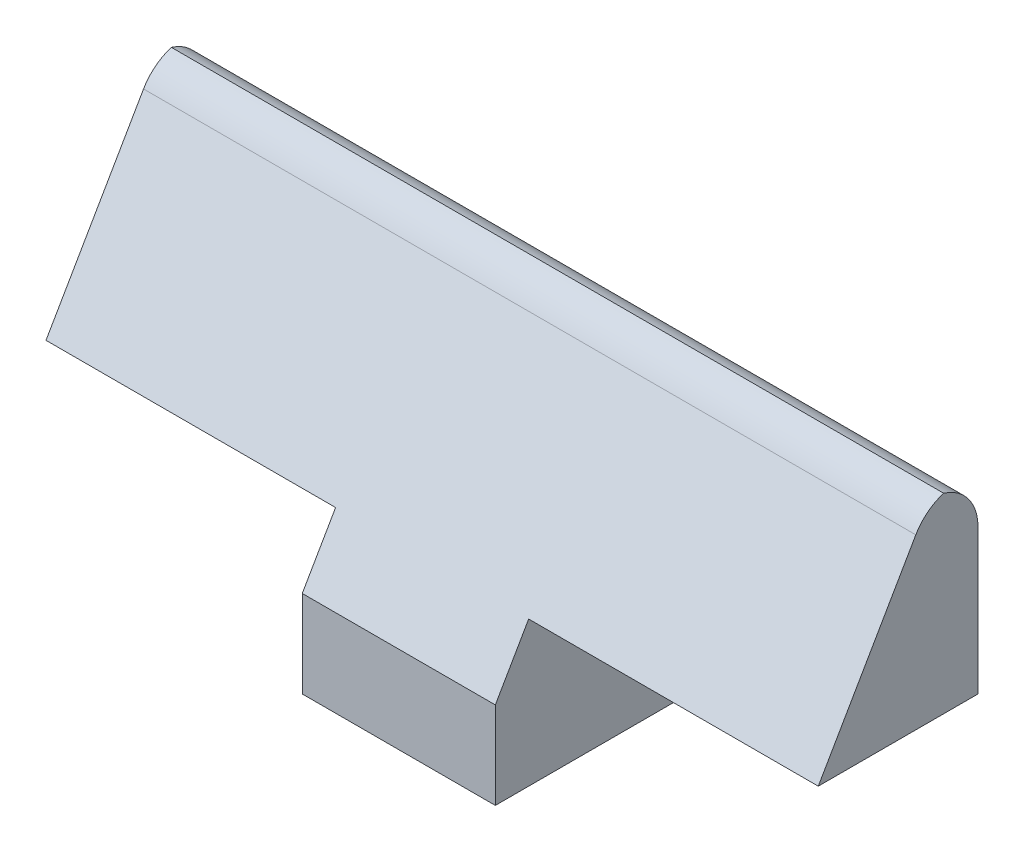
ISO-10303-21;
HEADER;
FILE_DESCRIPTION(('STEP AP214'),'2;1');
FILE_NAME('part.step','',(''),(''),'','','');
FILE_SCHEMA(('AUTOMOTIVE_DESIGN { 1 0 10303 214 1 1 1 1 }'));
ENDSEC;
DATA;
#1=APPLICATION_CONTEXT('core data for automotive mechanical design processes');
#2=APPLICATION_PROTOCOL_DEFINITION('international standard','automotive_design',2000,#1);
#3=PRODUCT_CONTEXT('',#1,'mechanical');
#4=PRODUCT('Part','Part','',(#3));
#5=PRODUCT_RELATED_PRODUCT_CATEGORY('part','',(#4));
#6=PRODUCT_DEFINITION_FORMATION('','',#4);
#7=PRODUCT_DEFINITION_CONTEXT('part definition',#1,'design');
#8=PRODUCT_DEFINITION('design','',#6,#7);
#9=PRODUCT_DEFINITION_SHAPE('','',#8);
#10=(LENGTH_UNIT() NAMED_UNIT(*) SI_UNIT(.MILLI.,.METRE.));
#11=(NAMED_UNIT(*) PLANE_ANGLE_UNIT() SI_UNIT($,.RADIAN.));
#12=(NAMED_UNIT(*) SI_UNIT($,.STERADIAN.) SOLID_ANGLE_UNIT());
#13=UNCERTAINTY_MEASURE_WITH_UNIT(LENGTH_MEASURE(1.E-05),#10,'distance_accuracy_value','');
#14=(GEOMETRIC_REPRESENTATION_CONTEXT(3) GLOBAL_UNCERTAINTY_ASSIGNED_CONTEXT((#13)) GLOBAL_UNIT_ASSIGNED_CONTEXT((#10,
#11,#12)) REPRESENTATION_CONTEXT('',''));
#15=CARTESIAN_POINT('',(0.,0.,0.));
#16=DIRECTION('',(0.,0.,1.));
#17=DIRECTION('',(1.,0.,0.));
#18=AXIS2_PLACEMENT_3D('',#15,#16,#17);
#19=CARTESIAN_POINT('',(25.4,0.,25.4));
#20=DIRECTION('',(0.,1.,0.));
#21=DIRECTION('',(0.,0.,1.));
#22=AXIS2_PLACEMENT_3D('',#19,#20,#21);
#23=PLANE('',#22);
#24=CARTESIAN_POINT('',(12.7,0.,12.7));
#25=DIRECTION('',(0.,-1.,0.));
#26=DIRECTION('',(0.,0.,-1.));
#27=AXIS2_PLACEMENT_3D('',#24,#25,#26);
#28=CIRCLE('',#27,8.33374);
#29=CARTESIAN_POINT('',(12.7,0.,4.36626));
#30=VERTEX_POINT('',#29);
#31=EDGE_CURVE('E126',#30,#30,#28,.T.);
#32=ORIENTED_EDGE('',*,*,#31,.F.);
#33=EDGE_LOOP('',(#32));
#34=FACE_BOUND('',#33,.T.);
#35=DIRECTION('',(1.,0.,0.));
#36=VECTOR('',#35,1.);
#37=CARTESIAN_POINT('',(25.4,0.,0.));
#38=LINE('',#37,#36);
#39=CARTESIAN_POINT('',(0.,0.,0.));
#40=VERTEX_POINT('',#39);
#41=CARTESIAN_POINT('',(25.4,0.,0.));
#42=VERTEX_POINT('',#41);
#43=EDGE_CURVE('E141',#40,#42,#38,.T.);
#44=ORIENTED_EDGE('',*,*,#43,.T.);
#45=DIRECTION('',(0.,0.,-1.));
#46=VECTOR('',#45,1.);
#47=CARTESIAN_POINT('',(25.4,0.,25.4));
#48=LINE('',#47,#46);
#49=CARTESIAN_POINT('',(25.4,0.,25.4));
#50=VERTEX_POINT('',#49);
#51=EDGE_CURVE('E169',#50,#42,#48,.T.);
#52=ORIENTED_EDGE('',*,*,#51,.F.);
#53=DIRECTION('',(1.,0.,0.));
#54=VECTOR('',#53,1.);
#55=CARTESIAN_POINT('',(25.4,0.,25.4));
#56=LINE('',#55,#54);
#57=CARTESIAN_POINT('',(0.,0.,25.4));
#58=VERTEX_POINT('',#57);
#59=EDGE_CURVE('E131',#58,#50,#56,.T.);
#60=ORIENTED_EDGE('',*,*,#59,.F.);
#61=DIRECTION('',(0.,0.,-1.));
#62=VECTOR('',#61,1.);
#63=CARTESIAN_POINT('',(0.,0.,25.4));
#64=LINE('',#63,#62);
#65=EDGE_CURVE('E140',#58,#40,#64,.T.);
#66=ORIENTED_EDGE('',*,*,#65,.T.);
#67=EDGE_LOOP('',(#44,#52,#60,#66));
#68=FACE_BOUND('',#67,.T.);
#69=ADVANCED_FACE('F42',(#34,#68),#23,.F.);
#70=CARTESIAN_POINT('',(25.4,19.05,25.4));
#71=DIRECTION('',(-1.,0.,0.));
#72=DIRECTION('',(0.,0.,1.));
#73=AXIS2_PLACEMENT_3D('',#70,#71,#72);
#74=PLANE('',#73);
#75=DIRECTION('',(0.,0.,-1.));
#76=VECTOR('',#75,1.);
#77=CARTESIAN_POINT('',(25.4,19.05,25.4));
#78=LINE('',#77,#76);
#79=CARTESIAN_POINT('',(25.4,19.05,21.0146968374165));
#80=VERTEX_POINT('',#79);
#81=CARTESIAN_POINT('',(25.4,19.05,0.));
#82=VERTEX_POINT('',#81);
#83=EDGE_CURVE('E167',#80,#82,#78,.T.);
#84=ORIENTED_EDGE('',*,*,#83,.F.);
#85=DIRECTION('',(0.,0.866025403784438,-0.500000000000001));
#86=VECTOR('',#85,1.);
#87=CARTESIAN_POINT('',(25.4,11.4544321158129,25.4));
#88=LINE('',#87,#86);
#89=CARTESIAN_POINT('',(25.4,11.4544321158129,25.4));
#90=VERTEX_POINT('',#89);
#91=EDGE_CURVE('E186',#80,#90,#88,.F.);
#92=ORIENTED_EDGE('',*,*,#91,.T.);
#93=DIRECTION('',(0.,1.,0.));
#94=VECTOR('',#93,1.);
#95=CARTESIAN_POINT('',(25.4,19.05,25.4));
#96=LINE('',#95,#94);
#97=EDGE_CURVE('E134',#50,#90,#96,.T.);
#98=ORIENTED_EDGE('',*,*,#97,.F.);
#99=ORIENTED_EDGE('',*,*,#51,.T.);
#100=DIRECTION('',(0.,1.,0.));
#101=VECTOR('',#100,1.);
#102=CARTESIAN_POINT('',(25.4,19.05,0.));
#103=LINE('',#102,#101);
#104=EDGE_CURVE('E144',#42,#82,#103,.T.);
#105=ORIENTED_EDGE('',*,*,#104,.T.);
#106=EDGE_LOOP('',(#84,#92,#98,#99,#105));
#107=FACE_BOUND('',#106,.T.);
#108=ADVANCED_FACE('F215',(#107),#74,.F.);
#109=CARTESIAN_POINT('',(63.5,19.05,25.4));
#110=DIRECTION('',(0.,1.,0.));
#111=DIRECTION('',(0.,0.,1.));
#112=AXIS2_PLACEMENT_3D('',#109,#110,#111);
#113=PLANE('',#112);
#114=DIRECTION('',(0.,0.,-1.));
#115=VECTOR('',#114,1.);
#116=CARTESIAN_POINT('',(63.5,19.05,25.4));
#117=LINE('',#116,#115);
#118=CARTESIAN_POINT('',(63.5,19.05,21.0146968374165));
#119=VERTEX_POINT('',#118);
#120=CARTESIAN_POINT('',(63.5,19.05,0.));
#121=VERTEX_POINT('',#120);
#122=EDGE_CURVE('E165',#119,#121,#117,.T.);
#123=ORIENTED_EDGE('',*,*,#122,.F.);
#124=DIRECTION('',(1.,0.,0.));
#125=VECTOR('',#124,1.);
#126=CARTESIAN_POINT('',(0.,19.05,21.0146968374165));
#127=LINE('',#126,#125);
#128=EDGE_CURVE('E184',#119,#80,#127,.F.);
#129=ORIENTED_EDGE('',*,*,#128,.T.);
#130=ORIENTED_EDGE('',*,*,#83,.T.);
#131=DIRECTION('',(1.,0.,0.));
#132=VECTOR('',#131,1.);
#133=CARTESIAN_POINT('',(63.5,19.05,0.));
#134=LINE('',#133,#132);
#135=EDGE_CURVE('E147',#82,#121,#134,.T.);
#136=ORIENTED_EDGE('',*,*,#135,.T.);
#137=EDGE_LOOP('',(#123,#129,#130,#136));
#138=FACE_BOUND('',#137,.T.);
#139=ADVANCED_FACE('F209',(#138),#113,.F.);
#140=CARTESIAN_POINT('',(63.5,44.45,25.4));
#141=DIRECTION('',(-1.,0.,0.));
#142=DIRECTION('',(0.,0.,1.));
#143=AXIS2_PLACEMENT_3D('',#140,#141,#142);
#144=PLANE('',#143);
#145=DIRECTION('',(0.,1.,0.));
#146=VECTOR('',#145,1.);
#147=CARTESIAN_POINT('',(63.5,44.45,0.));
#148=LINE('',#147,#146);
#149=CARTESIAN_POINT('',(63.5,38.1,0.));
#150=VERTEX_POINT('',#149);
#151=EDGE_CURVE('E150',#121,#150,#148,.T.);
#152=ORIENTED_EDGE('',*,*,#151,.T.);
#153=CARTESIAN_POINT('',(63.5,38.1,6.35));
#154=DIRECTION('',(-1.,0.,0.));
#155=DIRECTION('',(0.,0.,1.));
#156=AXIS2_PLACEMENT_3D('',#153,#154,#155);
#157=CIRCLE('',#156,6.35);
#158=CARTESIAN_POINT('',(63.5,44.1796621342527,4.51691289532292));
#159=VERTEX_POINT('',#158);
#160=EDGE_CURVE('E51',#150,#159,#157,.F.);
#161=ORIENTED_EDGE('',*,*,#160,.T.);
#162=CARTESIAN_POINT('',(63.5,38.1,2.68382579064584));
#163=DIRECTION('',(-1.,0.,0.));
#164=DIRECTION('',(0.,0.,1.));
#165=AXIS2_PLACEMENT_3D('',#162,#163,#164);
#166=CIRCLE('',#165,6.35);
#167=CARTESIAN_POINT('',(63.5,41.275,8.18308710467703));
#168=VERTEX_POINT('',#167);
#169=EDGE_CURVE('E61',#159,#168,#166,.F.);
#170=ORIENTED_EDGE('',*,*,#169,.T.);
#171=DIRECTION('',(0.,0.866025403784438,-0.500000000000001));
#172=VECTOR('',#171,1.);
#173=CARTESIAN_POINT('',(63.5,11.4544321158129,25.4));
#174=LINE('',#173,#172);
#175=EDGE_CURVE('E182',#168,#119,#174,.F.);
#176=ORIENTED_EDGE('',*,*,#175,.T.);
#177=ORIENTED_EDGE('',*,*,#122,.T.);
#178=EDGE_LOOP('',(#152,#161,#170,#176,#177));
#179=FACE_BOUND('',#178,.T.);
#180=ADVANCED_FACE('F205',(#179),#144,.F.);
#181=CARTESIAN_POINT('',(-38.1,19.05,25.4));
#182=DIRECTION('',(1.,0.,0.));
#183=DIRECTION('',(0.,0.,-1.));
#184=AXIS2_PLACEMENT_3D('',#181,#182,#183);
#185=PLANE('',#184);
#186=CARTESIAN_POINT('',(-38.1,38.1,2.68382579064584));
#187=DIRECTION('',(1.,0.,0.));
#188=DIRECTION('',(0.,0.,-1.));
#189=AXIS2_PLACEMENT_3D('',#186,#187,#188);
#190=CIRCLE('',#189,6.35);
#191=CARTESIAN_POINT('',(-38.1,41.275,8.18308710467703));
#192=VERTEX_POINT('',#191);
#193=CARTESIAN_POINT('',(-38.1,44.1796621342527,4.51691289532292));
#194=VERTEX_POINT('',#193);
#195=EDGE_CURVE('E188',#192,#194,#190,.F.);
#196=ORIENTED_EDGE('',*,*,#195,.T.);
#197=CARTESIAN_POINT('',(-38.1,38.1,6.35));
#198=DIRECTION('',(1.,0.,0.));
#199=DIRECTION('',(0.,0.,-1.));
#200=AXIS2_PLACEMENT_3D('',#197,#198,#199);
#201=CIRCLE('',#200,6.35);
#202=CARTESIAN_POINT('',(-38.1,38.1,0.));
#203=VERTEX_POINT('',#202);
#204=EDGE_CURVE('E190',#194,#203,#201,.F.);
#205=ORIENTED_EDGE('',*,*,#204,.T.);
#206=DIRECTION('',(0.,-1.,0.));
#207=VECTOR('',#206,1.);
#208=CARTESIAN_POINT('',(-38.1,19.05,0.));
#209=LINE('',#208,#207);
#210=CARTESIAN_POINT('',(-38.1,19.05,0.));
#211=VERTEX_POINT('',#210);
#212=EDGE_CURVE('E152',#203,#211,#209,.T.);
#213=ORIENTED_EDGE('',*,*,#212,.T.);
#214=DIRECTION('',(0.,0.,-1.));
#215=VECTOR('',#214,1.);
#216=CARTESIAN_POINT('',(-38.1,19.05,25.4));
#217=LINE('',#216,#215);
#218=CARTESIAN_POINT('',(-38.1,19.05,21.0146968374165));
#219=VERTEX_POINT('',#218);
#220=EDGE_CURVE('E162',#219,#211,#217,.T.);
#221=ORIENTED_EDGE('',*,*,#220,.F.);
#222=DIRECTION('',(0.,-0.866025403784438,0.500000000000001));
#223=VECTOR('',#222,1.);
#224=CARTESIAN_POINT('',(-38.1,11.4544321158129,25.4));
#225=LINE('',#224,#223);
#226=EDGE_CURVE('E179',#219,#192,#225,.F.);
#227=ORIENTED_EDGE('',*,*,#226,.T.);
#228=EDGE_LOOP('',(#196,#205,#213,#221,#227));
#229=FACE_BOUND('',#228,.T.);
#230=ADVANCED_FACE('F229',(#229),#185,.F.);
#231=CARTESIAN_POINT('',(0.,19.05,25.4));
#232=DIRECTION('',(0.,1.,0.));
#233=DIRECTION('',(0.,0.,1.));
#234=AXIS2_PLACEMENT_3D('',#231,#232,#233);
#235=PLANE('',#234);
#236=DIRECTION('',(0.,0.,-1.));
#237=VECTOR('',#236,1.);
#238=CARTESIAN_POINT('',(0.,19.05,25.4));
#239=LINE('',#238,#237);
#240=CARTESIAN_POINT('',(0.,19.05,21.0146968374165));
#241=VERTEX_POINT('',#240);
#242=CARTESIAN_POINT('',(0.,19.05,0.));
#243=VERTEX_POINT('',#242);
#244=EDGE_CURVE('E160',#241,#243,#239,.T.);
#245=ORIENTED_EDGE('',*,*,#244,.F.);
#246=DIRECTION('',(1.,0.,0.));
#247=VECTOR('',#246,1.);
#248=CARTESIAN_POINT('',(0.,19.05,21.0146968374165));
#249=LINE('',#248,#247);
#250=EDGE_CURVE('E177',#241,#219,#249,.F.);
#251=ORIENTED_EDGE('',*,*,#250,.T.);
#252=ORIENTED_EDGE('',*,*,#220,.T.);
#253=DIRECTION('',(1.,0.,0.));
#254=VECTOR('',#253,1.);
#255=CARTESIAN_POINT('',(0.,19.05,0.));
#256=LINE('',#255,#254);
#257=EDGE_CURVE('E154',#211,#243,#256,.T.);
#258=ORIENTED_EDGE('',*,*,#257,.T.);
#259=EDGE_LOOP('',(#245,#251,#252,#258));
#260=FACE_BOUND('',#259,.T.);
#261=ADVANCED_FACE('F224',(#260),#235,.F.);
#262=CARTESIAN_POINT('',(0.,0.,25.4));
#263=DIRECTION('',(1.,0.,0.));
#264=DIRECTION('',(0.,0.,-1.));
#265=AXIS2_PLACEMENT_3D('',#262,#263,#264);
#266=PLANE('',#265);
#267=DIRECTION('',(0.,-1.,0.));
#268=VECTOR('',#267,1.);
#269=CARTESIAN_POINT('',(0.,0.,25.4));
#270=LINE('',#269,#268);
#271=CARTESIAN_POINT('',(0.,11.4544321158129,25.4));
#272=VERTEX_POINT('',#271);
#273=EDGE_CURVE('E138',#272,#58,#270,.T.);
#274=ORIENTED_EDGE('',*,*,#273,.F.);
#275=DIRECTION('',(0.,-0.866025403784438,0.500000000000001));
#276=VECTOR('',#275,1.);
#277=CARTESIAN_POINT('',(0.,11.4544321158129,25.4));
#278=LINE('',#277,#276);
#279=EDGE_CURVE('E175',#272,#241,#278,.F.);
#280=ORIENTED_EDGE('',*,*,#279,.T.);
#281=ORIENTED_EDGE('',*,*,#244,.T.);
#282=DIRECTION('',(0.,-1.,0.));
#283=VECTOR('',#282,1.);
#284=CARTESIAN_POINT('',(0.,0.,0.));
#285=LINE('',#284,#283);
#286=EDGE_CURVE('E135',#243,#40,#285,.T.);
#287=ORIENTED_EDGE('',*,*,#286,.T.);
#288=ORIENTED_EDGE('',*,*,#65,.F.);
#289=EDGE_LOOP('',(#274,#280,#281,#287,#288));
#290=FACE_BOUND('',#289,.T.);
#291=ADVANCED_FACE('F221',(#290),#266,.F.);
#292=CARTESIAN_POINT('',(0.,0.,25.4));
#293=DIRECTION('',(0.,0.,-1.));
#294=DIRECTION('',(-1.,0.,0.));
#295=AXIS2_PLACEMENT_3D('',#292,#293,#294);
#296=PLANE('',#295);
#297=ORIENTED_EDGE('',*,*,#97,.T.);
#298=DIRECTION('',(-1.,0.,0.));
#299=VECTOR('',#298,1.);
#300=CARTESIAN_POINT('',(0.,11.4544321158129,25.4));
#301=LINE('',#300,#299);
#302=EDGE_CURVE('E172',#90,#272,#301,.T.);
#303=ORIENTED_EDGE('',*,*,#302,.T.);
#304=ORIENTED_EDGE('',*,*,#273,.T.);
#305=ORIENTED_EDGE('',*,*,#59,.T.);
#306=EDGE_LOOP('',(#297,#303,#304,#305));
#307=FACE_BOUND('',#306,.T.);
#308=ADVANCED_FACE('F261',(#307),#296,.F.);
#309=CARTESIAN_POINT('',(0.,0.,0.));
#310=DIRECTION('',(0.,0.,-1.));
#311=DIRECTION('',(-1.,0.,0.));
#312=AXIS2_PLACEMENT_3D('',#309,#310,#311);
#313=PLANE('',#312);
#314=ORIENTED_EDGE('',*,*,#212,.F.);
#315=DIRECTION('',(-1.,0.,0.));
#316=VECTOR('',#315,1.);
#317=CARTESIAN_POINT('',(63.5,38.1,0.));
#318=LINE('',#317,#316);
#319=EDGE_CURVE('E192',#203,#150,#318,.F.);
#320=ORIENTED_EDGE('',*,*,#319,.T.);
#321=ORIENTED_EDGE('',*,*,#151,.F.);
#322=ORIENTED_EDGE('',*,*,#135,.F.);
#323=ORIENTED_EDGE('',*,*,#104,.F.);
#324=ORIENTED_EDGE('',*,*,#43,.F.);
#325=ORIENTED_EDGE('',*,*,#286,.F.);
#326=ORIENTED_EDGE('',*,*,#257,.F.);
#327=EDGE_LOOP('',(#314,#320,#321,#322,#323,#324,#325,#326));
#328=FACE_BOUND('',#327,.T.);
#329=ADVANCED_FACE('F200',(#328),#313,.T.);
#330=CARTESIAN_POINT('',(0.,11.4544321158129,25.4));
#331=DIRECTION('',(0.,-0.500000000000001,-0.866025403784438));
#332=DIRECTION('',(-1.,0.,0.));
#333=AXIS2_PLACEMENT_3D('',#330,#331,#332);
#334=PLANE('',#333);
#335=ORIENTED_EDGE('',*,*,#175,.F.);
#336=DIRECTION('',(1.,0.,0.));
#337=VECTOR('',#336,1.);
#338=CARTESIAN_POINT('',(-38.1,41.275,8.18308710467702));
#339=LINE('',#338,#337);
#340=EDGE_CURVE('E11',#168,#192,#339,.F.);
#341=ORIENTED_EDGE('',*,*,#340,.T.);
#342=ORIENTED_EDGE('',*,*,#226,.F.);
#343=ORIENTED_EDGE('',*,*,#250,.F.);
#344=ORIENTED_EDGE('',*,*,#279,.F.);
#345=ORIENTED_EDGE('',*,*,#302,.F.);
#346=ORIENTED_EDGE('',*,*,#91,.F.);
#347=ORIENTED_EDGE('',*,*,#128,.F.);
#348=EDGE_LOOP('',(#335,#341,#342,#343,#344,#345,#346,#347));
#349=FACE_BOUND('',#348,.T.);
#350=ADVANCED_FACE('F232',(#349),#334,.F.);
#351=CARTESIAN_POINT('',(-38.1,38.1,2.68382579064584));
#352=DIRECTION('',(1.,0.,0.));
#353=DIRECTION('',(0.,0.,-1.));
#354=AXIS2_PLACEMENT_3D('',#351,#352,#353);
#355=CYLINDRICAL_SURFACE('',#354,6.35);
#356=ORIENTED_EDGE('',*,*,#340,.F.);
#357=ORIENTED_EDGE('',*,*,#169,.F.);
#358=DIRECTION('',(1.,0.,0.));
#359=VECTOR('',#358,1.);
#360=CARTESIAN_POINT('',(12.7,44.1796621342527,4.51691289532292));
#361=LINE('',#360,#359);
#362=EDGE_CURVE('E46',#194,#159,#361,.T.);
#363=ORIENTED_EDGE('',*,*,#362,.F.);
#364=ORIENTED_EDGE('',*,*,#195,.F.);
#365=EDGE_LOOP('',(#356,#357,#363,#364));
#366=FACE_BOUND('',#365,.T.);
#367=ADVANCED_FACE('F44',(#366),#355,.T.);
#368=CARTESIAN_POINT('',(-38.1,38.1,6.35));
#369=DIRECTION('',(1.,0.,0.));
#370=DIRECTION('',(0.,0.,-1.));
#371=AXIS2_PLACEMENT_3D('',#368,#369,#370);
#372=CYLINDRICAL_SURFACE('',#371,6.35);
#373=ORIENTED_EDGE('',*,*,#160,.F.);
#374=ORIENTED_EDGE('',*,*,#319,.F.);
#375=ORIENTED_EDGE('',*,*,#204,.F.);
#376=ORIENTED_EDGE('',*,*,#362,.T.);
#377=EDGE_LOOP('',(#373,#374,#375,#376));
#378=FACE_BOUND('',#377,.T.);
#379=ADVANCED_FACE('F237',(#378),#372,.T.);
#380=CARTESIAN_POINT('',(12.7,0.,12.7));
#381=DIRECTION('',(0.,-1.,0.));
#382=DIRECTION('',(0.,0.,-1.));
#383=AXIS2_PLACEMENT_3D('',#380,#381,#382);
#384=CYLINDRICAL_SURFACE('',#383,8.33374);
#385=CARTESIAN_POINT('',(12.7,12.7,12.7));
#386=DIRECTION('',(0.,-1.,0.));
#387=DIRECTION('',(0.,0.,-1.));
#388=AXIS2_PLACEMENT_3D('',#385,#386,#387);
#389=CIRCLE('',#388,8.33374);
#390=CARTESIAN_POINT('',(12.7,12.7,4.36626));
#391=VERTEX_POINT('',#390);
#392=EDGE_CURVE('E124',#391,#391,#389,.T.);
#393=ORIENTED_EDGE('',*,*,#392,.F.);
#394=EDGE_LOOP('',(#393));
#395=FACE_BOUND('',#394,.T.);
#396=ORIENTED_EDGE('',*,*,#31,.T.);
#397=EDGE_LOOP('',(#396));
#398=FACE_BOUND('',#397,.T.);
#399=ADVANCED_FACE('F120',(#395,#398),#384,.F.);
#400=CARTESIAN_POINT('',(12.7,12.7,12.7));
#401=DIRECTION('',(0.,-1.,0.));
#402=DIRECTION('',(0.,0.,-1.));
#403=AXIS2_PLACEMENT_3D('',#400,#401,#402);
#404=CONICAL_SURFACE('',#403,8.33374,1.02974425867666);
#405=CARTESIAN_POINT('',(12.7,17.7074161752147,12.7));
#406=VERTEX_POINT('',#405);
#407=VERTEX_LOOP('',#406);
#408=FACE_BOUND('',#407,.T.);
#409=ORIENTED_EDGE('',*,*,#392,.T.);
#410=EDGE_LOOP('',(#409));
#411=FACE_BOUND('',#410,.T.);
#412=ADVANCED_FACE('F117',(#408,#411),#404,.F.);
#413=CLOSED_SHELL('',(#69,#108,#139,#180,#230,#261,#291,#308,#329,#350,#367,#379,#399,#412));
#414=MANIFOLD_SOLID_BREP('B2',#413);
#415=ADVANCED_BREP_SHAPE_REPRESENTATION('',(#18,#414),#14);
#416=SHAPE_DEFINITION_REPRESENTATION(#9,#415);
ENDSEC;
END-ISO-10303-21;
